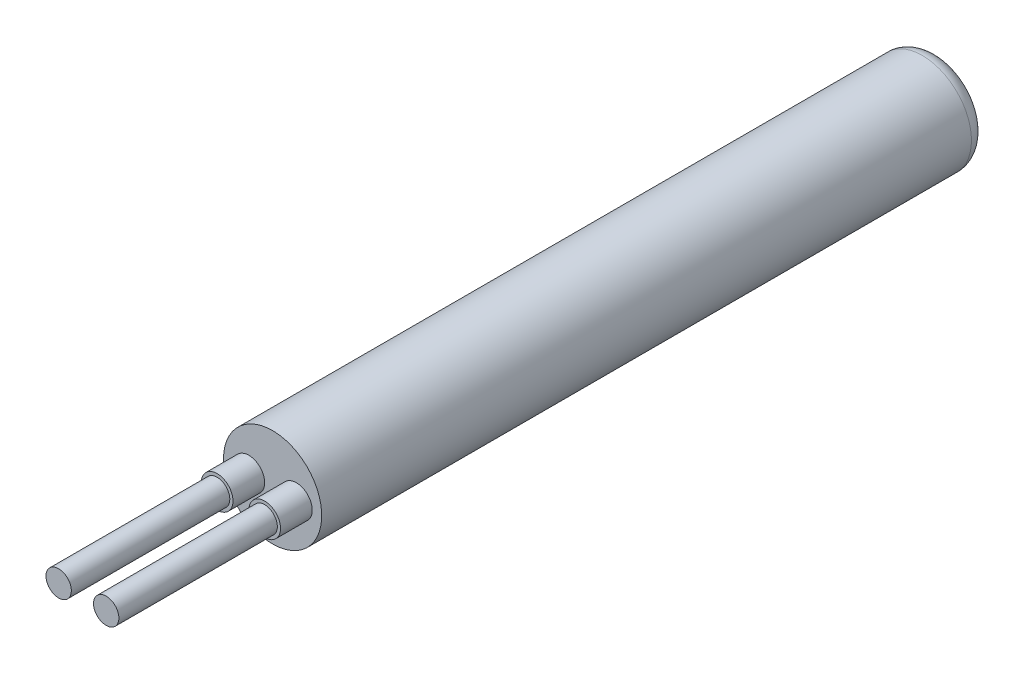
ISO-10303-21;
HEADER;
FILE_DESCRIPTION(('STEP AP214'),'2;1');
FILE_NAME('part.step','',(''),(''),'','','');
FILE_SCHEMA(('AUTOMOTIVE_DESIGN { 1 0 10303 214 1 1 1 1 }'));
ENDSEC;
DATA;
#1=APPLICATION_CONTEXT('core data for automotive mechanical design processes');
#2=APPLICATION_PROTOCOL_DEFINITION('international standard','automotive_design',2000,#1);
#3=PRODUCT_CONTEXT('',#1,'mechanical');
#4=PRODUCT('Part','Part','',(#3));
#5=PRODUCT_RELATED_PRODUCT_CATEGORY('part','',(#4));
#6=PRODUCT_DEFINITION_FORMATION('','',#4);
#7=PRODUCT_DEFINITION_CONTEXT('part definition',#1,'design');
#8=PRODUCT_DEFINITION('design','',#6,#7);
#9=PRODUCT_DEFINITION_SHAPE('','',#8);
#10=(LENGTH_UNIT() NAMED_UNIT(*) SI_UNIT(.MILLI.,.METRE.));
#11=(NAMED_UNIT(*) PLANE_ANGLE_UNIT() SI_UNIT($,.RADIAN.));
#12=(NAMED_UNIT(*) SI_UNIT($,.STERADIAN.) SOLID_ANGLE_UNIT());
#13=UNCERTAINTY_MEASURE_WITH_UNIT(LENGTH_MEASURE(1.E-05),#10,'distance_accuracy_value','');
#14=(GEOMETRIC_REPRESENTATION_CONTEXT(3) GLOBAL_UNCERTAINTY_ASSIGNED_CONTEXT((#13)) GLOBAL_UNIT_ASSIGNED_CONTEXT((#10,
#11,#12)) REPRESENTATION_CONTEXT('',''));
#15=CARTESIAN_POINT('',(0.,0.,0.));
#16=DIRECTION('',(0.,0.,1.));
#17=DIRECTION('',(1.,0.,0.));
#18=AXIS2_PLACEMENT_3D('',#15,#16,#17);
#19=CARTESIAN_POINT('',(0.,0.,21.));
#20=DIRECTION('',(0.,0.,1.));
#21=DIRECTION('',(1.,0.,0.));
#22=AXIS2_PLACEMENT_3D('',#19,#20,#21);
#23=PLANE('',#22);
#24=CARTESIAN_POINT('',(-0.75,0.,21.));
#25=DIRECTION('',(0.,0.,1.));
#26=DIRECTION('',(1.,0.,0.));
#27=AXIS2_PLACEMENT_3D('',#24,#25,#26);
#28=CIRCLE('',#27,0.5);
#29=CARTESIAN_POINT('',(-0.25,0.,21.));
#30=VERTEX_POINT('',#29);
#31=EDGE_CURVE('E56',#30,#30,#28,.T.);
#32=ORIENTED_EDGE('',*,*,#31,.F.);
#33=EDGE_LOOP('',(#32));
#34=FACE_BOUND('',#33,.T.);
#35=CARTESIAN_POINT('',(0.,0.,21.));
#36=DIRECTION('',(0.,0.,1.));
#37=DIRECTION('',(1.,0.,0.));
#38=AXIS2_PLACEMENT_3D('',#35,#36,#37);
#39=CIRCLE('',#38,1.55);
#40=CARTESIAN_POINT('',(-1.55,0.,21.));
#41=VERTEX_POINT('',#40);
#42=EDGE_CURVE('E43',#41,#41,#39,.T.);
#43=ORIENTED_EDGE('',*,*,#42,.T.);
#44=EDGE_LOOP('',(#43));
#45=FACE_BOUND('',#44,.T.);
#46=CARTESIAN_POINT('',(0.75,0.,21.));
#47=DIRECTION('',(0.,0.,1.));
#48=DIRECTION('',(1.,0.,0.));
#49=AXIS2_PLACEMENT_3D('',#46,#47,#48);
#50=CIRCLE('',#49,0.5);
#51=CARTESIAN_POINT('',(1.25,0.,21.));
#52=VERTEX_POINT('',#51);
#53=EDGE_CURVE('E65',#52,#52,#50,.T.);
#54=ORIENTED_EDGE('',*,*,#53,.F.);
#55=EDGE_LOOP('',(#54));
#56=FACE_BOUND('',#55,.T.);
#57=ADVANCED_FACE('F32',(#34,#45,#56),#23,.T.);
#58=CARTESIAN_POINT('',(0.,0.,21.));
#59=DIRECTION('',(0.,0.,-1.));
#60=DIRECTION('',(-1.,0.,0.));
#61=AXIS2_PLACEMENT_3D('',#58,#59,#60);
#62=CYLINDRICAL_SURFACE('',#61,1.55);
#63=CARTESIAN_POINT('',(0.,0.,0.499999999999997));
#64=DIRECTION('',(0.,0.,1.));
#65=DIRECTION('',(1.,0.,0.));
#66=AXIS2_PLACEMENT_3D('',#63,#64,#65);
#67=CIRCLE('',#66,1.55);
#68=CARTESIAN_POINT('',(-1.55,0.,0.499999999999994));
#69=VERTEX_POINT('',#68);
#70=EDGE_CURVE('E39',#69,#69,#67,.T.);
#71=CARTESIAN_POINT('',(-1.55,0.,0.499999999999994));
#72=CARTESIAN_POINT('',(-1.55,0.,0.71354166666666));
#73=CARTESIAN_POINT('',(-1.55,0.,0.927083333333326));
#74=CARTESIAN_POINT('',(-1.55,0.,1.35416666666666));
#75=CARTESIAN_POINT('',(-1.55,0.,1.56770833333333));
#76=CARTESIAN_POINT('',(-1.55,0.,1.99479166666666));
#77=CARTESIAN_POINT('',(-1.55,0.,2.20833333333333));
#78=CARTESIAN_POINT('',(-1.55,0.,2.63541666666666));
#79=CARTESIAN_POINT('',(-1.55,0.,2.84895833333333));
#80=CARTESIAN_POINT('',(-1.55,0.,3.27604166666666));
#81=CARTESIAN_POINT('',(-1.55,0.,3.48958333333333));
#82=CARTESIAN_POINT('',(-1.55,0.,3.91666666666666));
#83=CARTESIAN_POINT('',(-1.55,0.,4.13020833333333));
#84=CARTESIAN_POINT('',(-1.55,0.,4.55729166666666));
#85=CARTESIAN_POINT('',(-1.55,0.,4.77083333333333));
#86=CARTESIAN_POINT('',(-1.55,0.,5.19791666666666));
#87=CARTESIAN_POINT('',(-1.55,0.,5.41145833333333));
#88=CARTESIAN_POINT('',(-1.55,0.,5.83854166666666));
#89=CARTESIAN_POINT('',(-1.55,0.,6.05208333333333));
#90=CARTESIAN_POINT('',(-1.55,0.,6.47916666666666));
#91=CARTESIAN_POINT('',(-1.55,0.,6.69270833333333));
#92=CARTESIAN_POINT('',(-1.55,0.,7.11979166666666));
#93=CARTESIAN_POINT('',(-1.55,0.,7.33333333333333));
#94=CARTESIAN_POINT('',(-1.55,0.,7.76041666666666));
#95=CARTESIAN_POINT('',(-1.55,0.,7.97395833333333));
#96=CARTESIAN_POINT('',(-1.55,0.,8.40104166666666));
#97=CARTESIAN_POINT('',(-1.55,0.,8.61458333333333));
#98=CARTESIAN_POINT('',(-1.55,0.,9.04166666666666));
#99=CARTESIAN_POINT('',(-1.55,0.,9.25520833333333));
#100=CARTESIAN_POINT('',(-1.55,0.,9.68229166666666));
#101=CARTESIAN_POINT('',(-1.55,0.,9.89583333333333));
#102=CARTESIAN_POINT('',(-1.55,0.,10.3229166666667));
#103=CARTESIAN_POINT('',(-1.55,0.,10.5364583333333));
#104=CARTESIAN_POINT('',(-1.55,0.,10.9635416666667));
#105=CARTESIAN_POINT('',(-1.55,0.,11.1770833333333));
#106=CARTESIAN_POINT('',(-1.55,0.,11.6041666666667));
#107=CARTESIAN_POINT('',(-1.55,0.,11.8177083333333));
#108=CARTESIAN_POINT('',(-1.55,0.,12.2447916666667));
#109=CARTESIAN_POINT('',(-1.55,0.,12.4583333333333));
#110=CARTESIAN_POINT('',(-1.55,0.,12.8854166666667));
#111=CARTESIAN_POINT('',(-1.55,0.,13.0989583333333));
#112=CARTESIAN_POINT('',(-1.55,0.,13.5260416666667));
#113=CARTESIAN_POINT('',(-1.55,0.,13.7395833333333));
#114=CARTESIAN_POINT('',(-1.55,0.,14.1666666666667));
#115=CARTESIAN_POINT('',(-1.55,0.,14.3802083333333));
#116=CARTESIAN_POINT('',(-1.55,0.,14.8072916666667));
#117=CARTESIAN_POINT('',(-1.55,0.,15.0208333333333));
#118=CARTESIAN_POINT('',(-1.55,0.,15.4479166666667));
#119=CARTESIAN_POINT('',(-1.55,0.,15.6614583333333));
#120=CARTESIAN_POINT('',(-1.55,0.,16.0885416666667));
#121=CARTESIAN_POINT('',(-1.55,0.,16.3020833333333));
#122=CARTESIAN_POINT('',(-1.55,0.,16.7291666666667));
#123=CARTESIAN_POINT('',(-1.55,0.,16.9427083333333));
#124=CARTESIAN_POINT('',(-1.55,0.,17.3697916666667));
#125=CARTESIAN_POINT('',(-1.55,0.,17.5833333333333));
#126=CARTESIAN_POINT('',(-1.55,0.,18.0104166666667));
#127=CARTESIAN_POINT('',(-1.55,0.,18.2239583333333));
#128=CARTESIAN_POINT('',(-1.55,0.,18.6510416666667));
#129=CARTESIAN_POINT('',(-1.55,0.,18.8645833333333));
#130=CARTESIAN_POINT('',(-1.55,0.,19.2916666666667));
#131=CARTESIAN_POINT('',(-1.55,0.,19.5052083333333));
#132=CARTESIAN_POINT('',(-1.55,0.,19.9322916666667));
#133=CARTESIAN_POINT('',(-1.55,0.,20.1458333333333));
#134=CARTESIAN_POINT('',(-1.55,0.,20.5729166666667));
#135=CARTESIAN_POINT('',(-1.55,0.,20.7864583333333));
#136=CARTESIAN_POINT('',(-1.55,0.,21.));
#137=B_SPLINE_CURVE_WITH_KNOTS('',3,(#71,#72,#73,#74,#75,#76,#77,#78,#79,#80,#81,#82,#83,#84,
#85,#86,#87,#88,#89,#90,#91,#92,#93,#94,#95,#96,#97,#98,#99,#100,#101,#102,#103,#104,#105,#106,
#107,#108,#109,#110,#111,#112,#113,#114,#115,#116,#117,#118,#119,#120,#121,#122,#123,#124,#125,
#126,#127,#128,#129,#130,#131,#132,#133,#134,#135,#136),.UNSPECIFIED.,.F.,.F.,(4,2,2,2,2,2,2,2,
2,2,2,2,2,2,2,2,2,2,2,2,2,2,2,2,2,2,2,2,2,2,2,2,4),(0.,0.640624999999999,1.28125,1.921875,
2.5625,3.203125,3.84375,4.484375,5.125,5.765625,6.40625,7.046875,7.6875,8.328125,8.96875,
9.609375,10.25,10.890625,11.53125,12.171875,12.8125,13.453125,14.09375,14.734375,15.375,
16.015625,16.65625,17.296875,17.9375,18.578125,19.21875,19.859375,20.5),.UNSPECIFIED.);
#138=EDGE_CURVE('BSEAM94',#69,#41,#137,.T.);
#139=ORIENTED_EDGE('',*,*,#70,.T.);
#140=ORIENTED_EDGE('',*,*,#42,.F.);
#141=ORIENTED_EDGE('',*,*,#138,.T.);
#142=ORIENTED_EDGE('',*,*,#138,.F.);
#143=EDGE_LOOP('',(#139,#141,#140,#142));
#144=FACE_BOUND('',#143,.T.);
#145=ADVANCED_FACE('F94',(#144),#62,.T.);
#146=CARTESIAN_POINT('',(0.,0.,0.));
#147=DIRECTION('',(0.,0.,1.));
#148=DIRECTION('',(1.,0.,0.));
#149=AXIS2_PLACEMENT_3D('',#146,#147,#148);
#150=PLANE('',#149);
#151=CARTESIAN_POINT('',(0.,0.,0.));
#152=DIRECTION('',(0.,0.,1.));
#153=DIRECTION('',(1.,0.,0.));
#154=AXIS2_PLACEMENT_3D('',#151,#152,#153);
#155=CIRCLE('',#154,1.05);
#156=CARTESIAN_POINT('',(1.05,0.,0.));
#157=VERTEX_POINT('',#156);
#158=EDGE_CURVE('E10',#157,#157,#155,.F.);
#159=ORIENTED_EDGE('',*,*,#158,.T.);
#160=EDGE_LOOP('',(#159));
#161=FACE_BOUND('',#160,.T.);
#162=ADVANCED_FACE('F100',(#161),#150,.F.);
#163=CARTESIAN_POINT('',(-0.75,0.,22.));
#164=DIRECTION('',(0.,0.,1.));
#165=DIRECTION('',(1.,0.,0.));
#166=AXIS2_PLACEMENT_3D('',#163,#164,#165);
#167=PLANE('',#166);
#168=CARTESIAN_POINT('',(-0.75,0.,22.));
#169=DIRECTION('',(0.,0.,1.));
#170=DIRECTION('',(1.,0.,0.));
#171=AXIS2_PLACEMENT_3D('',#168,#169,#170);
#172=CIRCLE('',#171,0.5);
#173=CARTESIAN_POINT('',(-0.25,0.,22.));
#174=VERTEX_POINT('',#173);
#175=EDGE_CURVE('E55',#174,#174,#172,.T.);
#176=ORIENTED_EDGE('',*,*,#175,.T.);
#177=EDGE_LOOP('',(#176));
#178=FACE_BOUND('',#177,.T.);
#179=CARTESIAN_POINT('',(-0.75,0.,22.));
#180=DIRECTION('',(0.,0.,1.));
#181=DIRECTION('',(1.,0.,0.));
#182=AXIS2_PLACEMENT_3D('',#179,#180,#181);
#183=CIRCLE('',#182,0.4);
#184=CARTESIAN_POINT('',(-0.35,0.,22.));
#185=VERTEX_POINT('',#184);
#186=EDGE_CURVE('E59',#185,#185,#183,.T.);
#187=ORIENTED_EDGE('',*,*,#186,.F.);
#188=EDGE_LOOP('',(#187));
#189=FACE_BOUND('',#188,.T.);
#190=ADVANCED_FACE('F107',(#178,#189),#167,.T.);
#191=CARTESIAN_POINT('',(-0.75,0.,22.));
#192=DIRECTION('',(0.,0.,-1.));
#193=DIRECTION('',(-1.,0.,0.));
#194=AXIS2_PLACEMENT_3D('',#191,#192,#193);
#195=CYLINDRICAL_SURFACE('',#194,0.5);
#196=ORIENTED_EDGE('',*,*,#175,.F.);
#197=EDGE_LOOP('',(#196));
#198=FACE_BOUND('',#197,.T.);
#199=ORIENTED_EDGE('',*,*,#31,.T.);
#200=EDGE_LOOP('',(#199));
#201=FACE_BOUND('',#200,.T.);
#202=ADVANCED_FACE('F111',(#198,#201),#195,.T.);
#203=CARTESIAN_POINT('',(-0.75,0.,27.));
#204=DIRECTION('',(0.,0.,1.));
#205=DIRECTION('',(1.,0.,0.));
#206=AXIS2_PLACEMENT_3D('',#203,#204,#205);
#207=PLANE('',#206);
#208=CARTESIAN_POINT('',(-0.75,0.,27.));
#209=DIRECTION('',(0.,0.,1.));
#210=DIRECTION('',(1.,0.,0.));
#211=AXIS2_PLACEMENT_3D('',#208,#209,#210);
#212=CIRCLE('',#211,0.4);
#213=CARTESIAN_POINT('',(-0.35,0.,27.));
#214=VERTEX_POINT('',#213);
#215=EDGE_CURVE('E52',#214,#214,#212,.T.);
#216=ORIENTED_EDGE('',*,*,#215,.T.);
#217=EDGE_LOOP('',(#216));
#218=FACE_BOUND('',#217,.T.);
#219=ADVANCED_FACE('F90',(#218),#207,.T.);
#220=CARTESIAN_POINT('',(-0.75,0.,27.));
#221=DIRECTION('',(0.,0.,-1.));
#222=DIRECTION('',(-1.,0.,0.));
#223=AXIS2_PLACEMENT_3D('',#220,#221,#222);
#224=CYLINDRICAL_SURFACE('',#223,0.4);
#225=ORIENTED_EDGE('',*,*,#186,.T.);
#226=EDGE_LOOP('',(#225));
#227=FACE_BOUND('',#226,.T.);
#228=ORIENTED_EDGE('',*,*,#215,.F.);
#229=EDGE_LOOP('',(#228));
#230=FACE_BOUND('',#229,.T.);
#231=ADVANCED_FACE('F80',(#227,#230),#224,.T.);
#232=CARTESIAN_POINT('',(0.75,0.,22.));
#233=DIRECTION('',(0.,0.,1.));
#234=DIRECTION('',(1.,0.,0.));
#235=AXIS2_PLACEMENT_3D('',#232,#233,#234);
#236=PLANE('',#235);
#237=CARTESIAN_POINT('',(0.75,0.,22.));
#238=DIRECTION('',(0.,0.,1.));
#239=DIRECTION('',(1.,0.,0.));
#240=AXIS2_PLACEMENT_3D('',#237,#238,#239);
#241=CIRCLE('',#240,0.5);
#242=CARTESIAN_POINT('',(1.25,0.,22.));
#243=VERTEX_POINT('',#242);
#244=EDGE_CURVE('E64',#243,#243,#241,.T.);
#245=ORIENTED_EDGE('',*,*,#244,.T.);
#246=EDGE_LOOP('',(#245));
#247=FACE_BOUND('',#246,.T.);
#248=CARTESIAN_POINT('',(0.75,0.,22.));
#249=DIRECTION('',(0.,0.,1.));
#250=DIRECTION('',(1.,0.,0.));
#251=AXIS2_PLACEMENT_3D('',#248,#249,#250);
#252=CIRCLE('',#251,0.4);
#253=CARTESIAN_POINT('',(1.15,0.,22.));
#254=VERTEX_POINT('',#253);
#255=EDGE_CURVE('E68',#254,#254,#252,.T.);
#256=ORIENTED_EDGE('',*,*,#255,.F.);
#257=EDGE_LOOP('',(#256));
#258=FACE_BOUND('',#257,.T.);
#259=ADVANCED_FACE('F77',(#247,#258),#236,.T.);
#260=CARTESIAN_POINT('',(0.75,0.,22.));
#261=DIRECTION('',(0.,0.,-1.));
#262=DIRECTION('',(-1.,0.,0.));
#263=AXIS2_PLACEMENT_3D('',#260,#261,#262);
#264=CYLINDRICAL_SURFACE('',#263,0.5);
#265=ORIENTED_EDGE('',*,*,#244,.F.);
#266=EDGE_LOOP('',(#265));
#267=FACE_BOUND('',#266,.T.);
#268=ORIENTED_EDGE('',*,*,#53,.T.);
#269=EDGE_LOOP('',(#268));
#270=FACE_BOUND('',#269,.T.);
#271=ADVANCED_FACE('F79',(#267,#270),#264,.T.);
#272=CARTESIAN_POINT('',(0.75,0.,27.));
#273=DIRECTION('',(0.,0.,1.));
#274=DIRECTION('',(1.,0.,0.));
#275=AXIS2_PLACEMENT_3D('',#272,#273,#274);
#276=PLANE('',#275);
#277=CARTESIAN_POINT('',(0.75,0.,27.));
#278=DIRECTION('',(0.,0.,1.));
#279=DIRECTION('',(1.,0.,0.));
#280=AXIS2_PLACEMENT_3D('',#277,#278,#279);
#281=CIRCLE('',#280,0.4);
#282=CARTESIAN_POINT('',(1.15,0.,27.));
#283=VERTEX_POINT('',#282);
#284=EDGE_CURVE('E47',#283,#283,#281,.T.);
#285=ORIENTED_EDGE('',*,*,#284,.T.);
#286=EDGE_LOOP('',(#285));
#287=FACE_BOUND('',#286,.T.);
#288=ADVANCED_FACE('F87',(#287),#276,.T.);
#289=CARTESIAN_POINT('',(0.75,0.,27.));
#290=DIRECTION('',(0.,0.,-1.));
#291=DIRECTION('',(-1.,0.,0.));
#292=AXIS2_PLACEMENT_3D('',#289,#290,#291);
#293=CYLINDRICAL_SURFACE('',#292,0.4);
#294=ORIENTED_EDGE('',*,*,#255,.T.);
#295=EDGE_LOOP('',(#294));
#296=FACE_BOUND('',#295,.T.);
#297=ORIENTED_EDGE('',*,*,#284,.F.);
#298=EDGE_LOOP('',(#297));
#299=FACE_BOUND('',#298,.T.);
#300=ADVANCED_FACE('F74',(#296,#299),#293,.T.);
#301=CARTESIAN_POINT('',(0.,0.,0.5));
#302=DIRECTION('',(0.,0.,1.));
#303=DIRECTION('',(1.,0.,0.));
#304=AXIS2_PLACEMENT_3D('',#301,#302,#303);
#305=TOROIDAL_SURFACE('',#304,1.05,0.5);
#306=ORIENTED_EDGE('',*,*,#158,.F.);
#307=EDGE_LOOP('',(#306));
#308=FACE_BOUND('',#307,.T.);
#309=ORIENTED_EDGE('',*,*,#70,.F.);
#310=EDGE_LOOP('',(#309));
#311=FACE_BOUND('',#310,.T.);
#312=ADVANCED_FACE('F34',(#308,#311),#305,.T.);
#313=CLOSED_SHELL('',(#57,#145,#162,#190,#202,#219,#231,#259,#271,#288,#300,#312));
#314=MANIFOLD_SOLID_BREP('B2',#313);
#315=ADVANCED_BREP_SHAPE_REPRESENTATION('',(#18,#314),#14);
#316=SHAPE_DEFINITION_REPRESENTATION(#9,#315);
ENDSEC;
END-ISO-10303-21;
